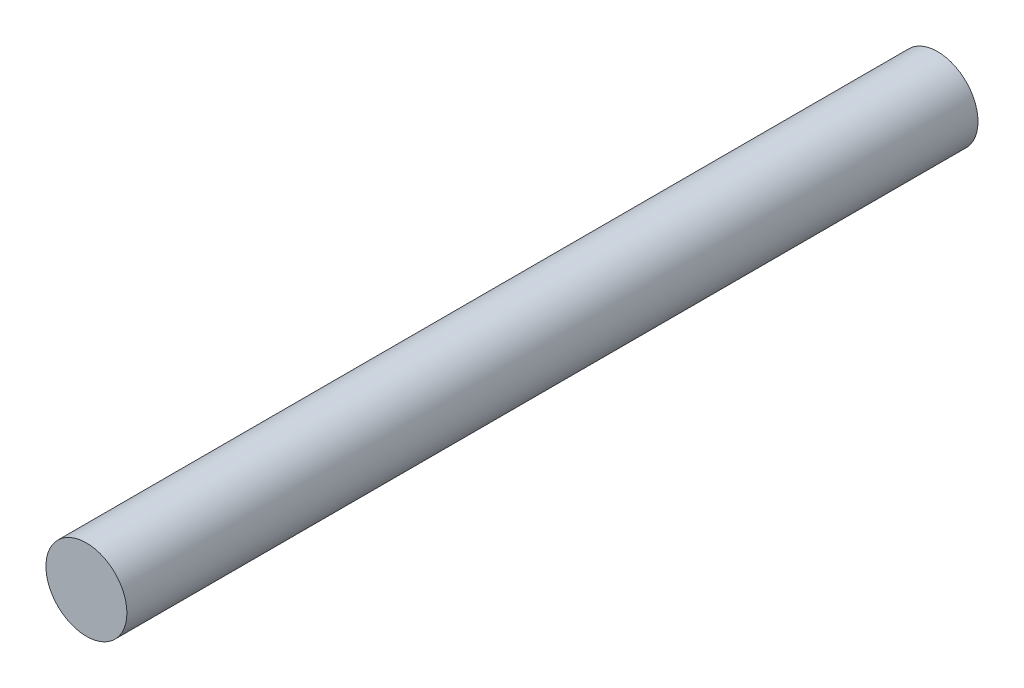
ISO-10303-21;
HEADER;
FILE_DESCRIPTION(('STEP AP214'),'2;1');
FILE_NAME('part.step','',(''),(''),'','','');
FILE_SCHEMA(('AUTOMOTIVE_DESIGN { 1 0 10303 214 1 1 1 1 }'));
ENDSEC;
DATA;
#1=APPLICATION_CONTEXT('core data for automotive mechanical design processes');
#2=APPLICATION_PROTOCOL_DEFINITION('international standard','automotive_design',2000,#1);
#3=PRODUCT_CONTEXT('',#1,'mechanical');
#4=PRODUCT('Part','Part','',(#3));
#5=PRODUCT_RELATED_PRODUCT_CATEGORY('part','',(#4));
#6=PRODUCT_DEFINITION_FORMATION('','',#4);
#7=PRODUCT_DEFINITION_CONTEXT('part definition',#1,'design');
#8=PRODUCT_DEFINITION('design','',#6,#7);
#9=PRODUCT_DEFINITION_SHAPE('','',#8);
#10=(LENGTH_UNIT() NAMED_UNIT(*) SI_UNIT(.MILLI.,.METRE.));
#11=(NAMED_UNIT(*) PLANE_ANGLE_UNIT() SI_UNIT($,.RADIAN.));
#12=(NAMED_UNIT(*) SI_UNIT($,.STERADIAN.) SOLID_ANGLE_UNIT());
#13=UNCERTAINTY_MEASURE_WITH_UNIT(LENGTH_MEASURE(1.E-05),#10,'distance_accuracy_value','');
#14=(GEOMETRIC_REPRESENTATION_CONTEXT(3) GLOBAL_UNCERTAINTY_ASSIGNED_CONTEXT((#13)) GLOBAL_UNIT_ASSIGNED_CONTEXT((#10,
#11,#12)) REPRESENTATION_CONTEXT('',''));
#15=CARTESIAN_POINT('',(0.,0.,0.));
#16=DIRECTION('',(0.,0.,1.));
#17=DIRECTION('',(1.,0.,0.));
#18=AXIS2_PLACEMENT_3D('',#15,#16,#17);
#19=CARTESIAN_POINT('',(0.,0.,84.09));
#20=DIRECTION('',(0.,0.,-1.));
#21=DIRECTION('',(-1.,0.,0.));
#22=AXIS2_PLACEMENT_3D('',#19,#20,#21);
#23=CYLINDRICAL_SURFACE('',#22,4.);
#24=CARTESIAN_POINT('',(0.,0.,84.09));
#25=DIRECTION('',(0.,0.,1.));
#26=DIRECTION('',(1.,0.,0.));
#27=AXIS2_PLACEMENT_3D('',#24,#25,#26);
#28=CIRCLE('',#27,4.);
#29=CARTESIAN_POINT('',(4.,0.,84.09));
#30=VERTEX_POINT('',#29);
#31=EDGE_CURVE('E10',#30,#30,#28,.T.);
#32=ORIENTED_EDGE('',*,*,#31,.F.);
#33=EDGE_LOOP('',(#32));
#34=FACE_BOUND('',#33,.T.);
#35=CARTESIAN_POINT('',(0.,0.,0.));
#36=DIRECTION('',(0.,0.,1.));
#37=DIRECTION('',(1.,0.,0.));
#38=AXIS2_PLACEMENT_3D('',#35,#36,#37);
#39=CIRCLE('',#38,4.);
#40=CARTESIAN_POINT('',(4.,0.,0.));
#41=VERTEX_POINT('',#40);
#42=EDGE_CURVE('E34',#41,#41,#39,.T.);
#43=ORIENTED_EDGE('',*,*,#42,.T.);
#44=EDGE_LOOP('',(#43));
#45=FACE_BOUND('',#44,.T.);
#46=ADVANCED_FACE('F31',(#34,#45),#23,.T.);
#47=CARTESIAN_POINT('',(0.,0.,84.09));
#48=DIRECTION('',(0.,0.,1.));
#49=DIRECTION('',(1.,0.,0.));
#50=AXIS2_PLACEMENT_3D('',#47,#48,#49);
#51=PLANE('',#50);
#52=ORIENTED_EDGE('',*,*,#31,.T.);
#53=EDGE_LOOP('',(#52));
#54=FACE_BOUND('',#53,.T.);
#55=ADVANCED_FACE('F46',(#54),#51,.T.);
#56=CARTESIAN_POINT('',(0.,0.,0.));
#57=DIRECTION('',(0.,0.,1.));
#58=DIRECTION('',(1.,0.,0.));
#59=AXIS2_PLACEMENT_3D('',#56,#57,#58);
#60=PLANE('',#59);
#61=ORIENTED_EDGE('',*,*,#42,.F.);
#62=EDGE_LOOP('',(#61));
#63=FACE_BOUND('',#62,.T.);
#64=ADVANCED_FACE('F44',(#63),#60,.F.);
#65=CLOSED_SHELL('',(#46,#55,#64));
#66=MANIFOLD_SOLID_BREP('B2',#65);
#67=ADVANCED_BREP_SHAPE_REPRESENTATION('',(#18,#66),#14);
#68=SHAPE_DEFINITION_REPRESENTATION(#9,#67);
ENDSEC;
END-ISO-10303-21;
